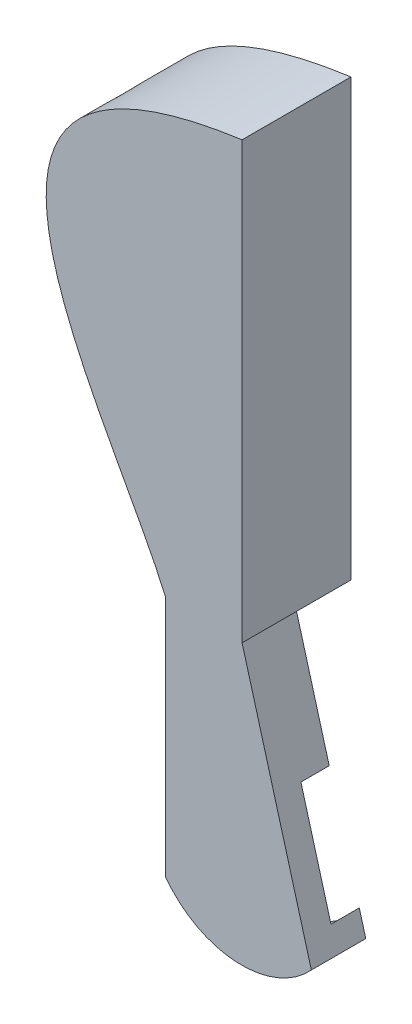
ISO-10303-21;
HEADER;
FILE_DESCRIPTION(('STEP AP214'),'2;1');
FILE_NAME('part.step','',(''),(''),'','','');
FILE_SCHEMA(('AUTOMOTIVE_DESIGN { 1 0 10303 214 1 1 1 1 }'));
ENDSEC;
DATA;
#1=APPLICATION_CONTEXT('core data for automotive mechanical design processes');
#2=APPLICATION_PROTOCOL_DEFINITION('international standard','automotive_design',2000,#1);
#3=PRODUCT_CONTEXT('',#1,'mechanical');
#4=PRODUCT('Part','Part','',(#3));
#5=PRODUCT_RELATED_PRODUCT_CATEGORY('part','',(#4));
#6=PRODUCT_DEFINITION_FORMATION('','',#4);
#7=PRODUCT_DEFINITION_CONTEXT('part definition',#1,'design');
#8=PRODUCT_DEFINITION('design','',#6,#7);
#9=PRODUCT_DEFINITION_SHAPE('','',#8);
#10=(LENGTH_UNIT() NAMED_UNIT(*) SI_UNIT(.MILLI.,.METRE.));
#11=(NAMED_UNIT(*) PLANE_ANGLE_UNIT() SI_UNIT($,.RADIAN.));
#12=(NAMED_UNIT(*) SI_UNIT($,.STERADIAN.) SOLID_ANGLE_UNIT());
#13=UNCERTAINTY_MEASURE_WITH_UNIT(LENGTH_MEASURE(1.E-05),#10,'distance_accuracy_value','');
#14=(GEOMETRIC_REPRESENTATION_CONTEXT(3) GLOBAL_UNCERTAINTY_ASSIGNED_CONTEXT((#13)) GLOBAL_UNIT_ASSIGNED_CONTEXT((#10,
#11,#12)) REPRESENTATION_CONTEXT('',''));
#15=CARTESIAN_POINT('',(0.,0.,0.));
#16=DIRECTION('',(0.,0.,1.));
#17=DIRECTION('',(1.,0.,0.));
#18=AXIS2_PLACEMENT_3D('',#15,#16,#17);
#19=CARTESIAN_POINT('',(0.220726200140617,284.828286352385,50.));
#20=CARTESIAN_POINT('',(-159.978737061135,262.606607754272,50.));
#21=CARTESIAN_POINT('',(-63.0007246030179,150.139017080568,50.));
#22=CARTESIAN_POINT('',(-35.,85.6249999999999,50.));
#23=B_SPLINE_CURVE_WITH_KNOTS('',3,(#19,#20,#21,#22),.UNSPECIFIED.,.F.,.F.,(4,4),(0.,1.),.UNSPECIFIED.);
#24=DIRECTION('',(0.,0.,-1.));
#25=VECTOR('',#24,1.);
#26=SURFACE_OF_LINEAR_EXTRUSION('',#23,#25);
#27=CARTESIAN_POINT('',(0.220726200140617,284.828286352385,0.));
#28=CARTESIAN_POINT('',(-159.978737061135,262.606607754272,0.));
#29=CARTESIAN_POINT('',(-63.0007246030179,150.139017080568,0.));
#30=CARTESIAN_POINT('',(-35.,85.6249999999999,0.));
#31=B_SPLINE_CURVE_WITH_KNOTS('',3,(#27,#28,#29,#30),.UNSPECIFIED.,.F.,.F.,(4,4),(0.,1.),.UNSPECIFIED.);
#32=CARTESIAN_POINT('',(0.220726200140617,284.828286352385,0.));
#33=VERTEX_POINT('',#32);
#34=CARTESIAN_POINT('',(-35.,85.6249999999999,0.));
#35=VERTEX_POINT('',#34);
#36=EDGE_CURVE('E133',#33,#35,#31,.T.);
#37=ORIENTED_EDGE('',*,*,#36,.T.);
#38=DIRECTION('',(0.,0.,-1.));
#39=VECTOR('',#38,1.);
#40=CARTESIAN_POINT('',(-35.,85.6249999999999,50.));
#41=LINE('',#40,#39);
#42=CARTESIAN_POINT('',(-35.,85.6249999999999,50.));
#43=VERTEX_POINT('',#42);
#44=EDGE_CURVE('E150',#43,#35,#41,.T.);
#45=ORIENTED_EDGE('',*,*,#44,.F.);
#46=CARTESIAN_POINT('',(0.220726200140617,284.828286352385,50.));
#47=VERTEX_POINT('',#46);
#48=EDGE_CURVE('E119',#47,#43,#23,.T.);
#49=ORIENTED_EDGE('',*,*,#48,.F.);
#50=DIRECTION('',(0.,0.,-1.));
#51=VECTOR('',#50,1.);
#52=CARTESIAN_POINT('',(0.220726200140617,284.828286352385,50.));
#53=LINE('',#52,#51);
#54=EDGE_CURVE('E132',#47,#33,#53,.T.);
#55=ORIENTED_EDGE('',*,*,#54,.T.);
#56=EDGE_LOOP('',(#37,#45,#49,#55));
#57=FACE_BOUND('',#56,.T.);
#58=ADVANCED_FACE('F33',(#57),#26,.F.);
#59=CARTESIAN_POINT('',(-35.,-85.6249999999999,50.));
#60=DIRECTION('',(1.,0.,0.));
#61=DIRECTION('',(0.,0.,-1.));
#62=AXIS2_PLACEMENT_3D('',#59,#60,#61);
#63=PLANE('',#62);
#64=DIRECTION('',(0.,-1.,0.));
#65=VECTOR('',#64,1.);
#66=CARTESIAN_POINT('',(-35.,-85.6249999999999,25.));
#67=LINE('',#66,#65);
#68=CARTESIAN_POINT('',(-35.,75.0232065963302,25.));
#69=VERTEX_POINT('',#68);
#70=CARTESIAN_POINT('',(-35.,-25.7429728987199,25.));
#71=VERTEX_POINT('',#70);
#72=EDGE_CURVE('E115',#69,#71,#67,.T.);
#73=ORIENTED_EDGE('',*,*,#72,.T.);
#74=DIRECTION('',(0.,0.,-1.));
#75=VECTOR('',#74,1.);
#76=CARTESIAN_POINT('',(-35.,-25.7429728987199,50.));
#77=LINE('',#76,#75);
#78=CARTESIAN_POINT('',(-35.,-25.7429728987199,50.));
#79=VERTEX_POINT('',#78);
#80=EDGE_CURVE('E48',#79,#71,#77,.T.);
#81=ORIENTED_EDGE('',*,*,#80,.F.);
#82=DIRECTION('',(0.,-1.,0.));
#83=VECTOR('',#82,1.);
#84=CARTESIAN_POINT('',(-35.,-85.6249999999999,50.));
#85=LINE('',#84,#83);
#86=EDGE_CURVE('E112',#43,#79,#85,.T.);
#87=ORIENTED_EDGE('',*,*,#86,.F.);
#88=ORIENTED_EDGE('',*,*,#44,.T.);
#89=DIRECTION('',(0.,-1.,0.));
#90=VECTOR('',#89,1.);
#91=CARTESIAN_POINT('',(-35.,-85.6249999999999,0.));
#92=LINE('',#91,#90);
#93=CARTESIAN_POINT('',(-35.,75.0232065963301,0.));
#94=VERTEX_POINT('',#93);
#95=EDGE_CURVE('E138',#35,#94,#92,.T.);
#96=ORIENTED_EDGE('',*,*,#95,.T.);
#97=DIRECTION('',(0.,0.,1.));
#98=VECTOR('',#97,1.);
#99=CARTESIAN_POINT('',(-35.,75.0232065963302,50.));
#100=LINE('',#99,#98);
#101=EDGE_CURVE('E174',#94,#69,#100,.T.);
#102=ORIENTED_EDGE('',*,*,#101,.T.);
#103=EDGE_LOOP('',(#73,#81,#87,#88,#96,#102));
#104=FACE_BOUND('',#103,.T.);
#105=ADVANCED_FACE('F110',(#104),#63,.F.);
#106=CARTESIAN_POINT('',(0.221790000790527,84.8282863552137,50.));
#107=DIRECTION('',(-0.963367879663412,-0.268183385825488,0.));
#108=DIRECTION('',(0.268183385825488,-0.963367879663412,0.));
#109=AXIS2_PLACEMENT_3D('',#106,#107,#108);
#110=PLANE('',#109);
#111=DIRECTION('',(-0.268183385825488,0.963367879663412,0.));
#112=VECTOR('',#111,1.);
#113=CARTESIAN_POINT('',(0.221790000790527,84.8282863552137,50.));
#114=LINE('',#113,#112);
#115=CARTESIAN_POINT('',(32.0135514067666,-29.3740221963309,50.));
#116=VERTEX_POINT('',#115);
#117=CARTESIAN_POINT('',(0.221790000790527,84.8282863552137,50.));
#118=VERTEX_POINT('',#117);
#119=EDGE_CURVE('E121',#116,#118,#114,.T.);
#120=ORIENTED_EDGE('',*,*,#119,.F.);
#121=DIRECTION('',(0.,0.,-1.));
#122=VECTOR('',#121,1.);
#123=CARTESIAN_POINT('',(32.0135514067666,-29.3740221963309,50.));
#124=LINE('',#123,#122);
#125=CARTESIAN_POINT('',(32.0135514067666,-29.3740221963309,25.));
#126=VERTEX_POINT('',#125);
#127=EDGE_CURVE('E102',#116,#126,#124,.T.);
#128=ORIENTED_EDGE('',*,*,#127,.T.);
#129=DIRECTION('',(0.268183385825487,-0.963367879663412,0.));
#130=VECTOR('',#129,1.);
#131=CARTESIAN_POINT('',(0.221790000790537,84.8282863552137,25.));
#132=LINE('',#131,#130);
#133=CARTESIAN_POINT('',(29.0271028135332,-18.6461068926618,25.));
#134=VERTEX_POINT('',#133);
#135=EDGE_CURVE('E158',#134,#126,#132,.T.);
#136=ORIENTED_EDGE('',*,*,#135,.F.);
#137=DIRECTION('',(0.,0.,-1.));
#138=VECTOR('',#137,1.);
#139=CARTESIAN_POINT('',(29.0271028135332,-18.6461068926618,38.));
#140=LINE('',#139,#138);
#141=CARTESIAN_POINT('',(29.0271028135332,-18.6461068926618,38.));
#142=VERTEX_POINT('',#141);
#143=EDGE_CURVE('E56',#134,#142,#140,.F.);
#144=ORIENTED_EDGE('',*,*,#143,.T.);
#145=DIRECTION('',(0.268183385825488,-0.963367879663412,0.));
#146=VECTOR('',#145,1.);
#147=CARTESIAN_POINT('',(0.221790000790527,84.8282863552137,38.));
#148=LINE('',#147,#146);
#149=CARTESIAN_POINT('',(15.2169204209926,30.9628056367827,38.));
#150=VERTEX_POINT('',#149);
#151=EDGE_CURVE('E11',#150,#142,#148,.T.);
#152=ORIENTED_EDGE('',*,*,#151,.F.);
#153=DIRECTION('',(0.,0.,-1.));
#154=VECTOR('',#153,1.);
#155=CARTESIAN_POINT('',(15.2169204209926,30.9628056367826,38.));
#156=LINE('',#155,#154);
#157=CARTESIAN_POINT('',(15.2169204209926,30.9628056367826,25.));
#158=VERTEX_POINT('',#157);
#159=EDGE_CURVE('E169',#150,#158,#156,.T.);
#160=ORIENTED_EDGE('',*,*,#159,.T.);
#161=CARTESIAN_POINT('',(0.221790000790537,84.8282863552137,25.));
#162=VERTEX_POINT('',#161);
#163=EDGE_CURVE('E160',#162,#158,#132,.T.);
#164=ORIENTED_EDGE('',*,*,#163,.F.);
#165=DIRECTION('',(0.,0.,-1.));
#166=VECTOR('',#165,1.);
#167=CARTESIAN_POINT('',(0.221790000790527,84.8282863552137,50.));
#168=LINE('',#167,#166);
#169=EDGE_CURVE('E147',#118,#162,#168,.T.);
#170=ORIENTED_EDGE('',*,*,#169,.F.);
#171=EDGE_LOOP('',(#120,#128,#136,#144,#152,#160,#164,#170));
#172=FACE_BOUND('',#171,.T.);
#173=ADVANCED_FACE('F163',(#172),#110,.F.);
#174=CARTESIAN_POINT('',(0.221790000790527,84.8282863552137,50.));
#175=DIRECTION('',(-0.999999999985854,-5.31900324955009E-06,0.));
#176=DIRECTION('',(5.31900324955009E-06,-0.999999999985854,0.));
#177=AXIS2_PLACEMENT_3D('',#174,#175,#176);
#178=PLANE('',#177);
#179=DIRECTION('',(-5.31900324955009E-06,0.999999999985854,0.));
#180=VECTOR('',#179,1.);
#181=CARTESIAN_POINT('',(0.221790000790527,84.8282863552137,0.));
#182=LINE('',#181,#180);
#183=CARTESIAN_POINT('',(0.221790000790537,84.8282863552137,0.));
#184=VERTEX_POINT('',#183);
#185=EDGE_CURVE('E125',#184,#33,#182,.T.);
#186=ORIENTED_EDGE('',*,*,#185,.T.);
#187=ORIENTED_EDGE('',*,*,#54,.F.);
#188=DIRECTION('',(-5.31900324955009E-06,0.999999999985854,0.));
#189=VECTOR('',#188,1.);
#190=CARTESIAN_POINT('',(0.221790000790527,84.8282863552137,50.));
#191=LINE('',#190,#189);
#192=EDGE_CURVE('E123',#118,#47,#191,.T.);
#193=ORIENTED_EDGE('',*,*,#192,.F.);
#194=ORIENTED_EDGE('',*,*,#169,.T.);
#195=DIRECTION('',(0.,0.,1.));
#196=VECTOR('',#195,1.);
#197=CARTESIAN_POINT('',(0.221790000790537,84.8282863552137,-41.3763691391845));
#198=LINE('',#197,#196);
#199=EDGE_CURVE('E165',#184,#162,#198,.T.);
#200=ORIENTED_EDGE('',*,*,#199,.F.);
#201=EDGE_LOOP('',(#186,#187,#193,#194,#200));
#202=FACE_BOUND('',#201,.T.);
#203=ADVANCED_FACE('F186',(#202),#178,.F.);
#204=CARTESIAN_POINT('',(-87.9647073490397,201.086270107113,50.));
#205=DIRECTION('',(0.,0.,-1.));
#206=DIRECTION('',(-1.,0.,0.));
#207=AXIS2_PLACEMENT_3D('',#204,#205,#206);
#208=PLANE('',#207);
#209=ORIENTED_EDGE('',*,*,#86,.T.);
#210=CARTESIAN_POINT('',(0.,0.,50.));
#211=DIRECTION('',(0.,0.,1.));
#212=DIRECTION('',(-1.,0.,0.));
#213=AXIS2_PLACEMENT_3D('',#210,#211,#212);
#214=CIRCLE('',#213,43.4476771952682);
#215=EDGE_CURVE('E99',#79,#116,#214,.T.);
#216=ORIENTED_EDGE('',*,*,#215,.T.);
#217=ORIENTED_EDGE('',*,*,#119,.T.);
#218=ORIENTED_EDGE('',*,*,#192,.T.);
#219=ORIENTED_EDGE('',*,*,#48,.T.);
#220=EDGE_LOOP('',(#209,#216,#217,#218,#219));
#221=FACE_BOUND('',#220,.T.);
#222=ADVANCED_FACE('F117',(#221),#208,.F.);
#223=CARTESIAN_POINT('',(-87.9647073490397,201.086270107113,0.));
#224=DIRECTION('',(0.,0.,-1.));
#225=DIRECTION('',(-1.,0.,0.));
#226=AXIS2_PLACEMENT_3D('',#223,#224,#225);
#227=PLANE('',#226);
#228=DIRECTION('',(0.963367879663412,0.268183385825488,0.));
#229=VECTOR('',#228,1.);
#230=CARTESIAN_POINT('',(-51.5858024995493,70.4060330691039,0.));
#231=LINE('',#230,#229);
#232=EDGE_CURVE('E152',#94,#184,#231,.T.);
#233=ORIENTED_EDGE('',*,*,#232,.F.);
#234=ORIENTED_EDGE('',*,*,#95,.F.);
#235=ORIENTED_EDGE('',*,*,#36,.F.);
#236=ORIENTED_EDGE('',*,*,#185,.F.);
#237=EDGE_LOOP('',(#233,#234,#235,#236));
#238=FACE_BOUND('',#237,.T.);
#239=ADVANCED_FACE('F182',(#238),#227,.T.);
#240=CARTESIAN_POINT('',(-132.824758814397,47.7906450897407,25.));
#241=DIRECTION('',(0.,0.,1.));
#242=DIRECTION('',(1.,0.,0.));
#243=AXIS2_PLACEMENT_3D('',#240,#241,#242);
#244=PLANE('',#243);
#245=ORIENTED_EDGE('',*,*,#135,.T.);
#246=CARTESIAN_POINT('',(0.,0.,25.));
#247=DIRECTION('',(0.,0.,1.));
#248=DIRECTION('',(-1.,0.,0.));
#249=AXIS2_PLACEMENT_3D('',#246,#247,#248);
#250=CIRCLE('',#249,43.4476771952682);
#251=EDGE_CURVE('E106',#71,#126,#250,.T.);
#252=ORIENTED_EDGE('',*,*,#251,.F.);
#253=ORIENTED_EDGE('',*,*,#72,.F.);
#254=DIRECTION('',(0.963367879663412,0.268183385825488,0.));
#255=VECTOR('',#254,1.);
#256=CARTESIAN_POINT('',(-132.824758814397,47.7906450897407,25.));
#257=LINE('',#256,#255);
#258=EDGE_CURVE('E167',#69,#162,#257,.T.);
#259=ORIENTED_EDGE('',*,*,#258,.T.);
#260=ORIENTED_EDGE('',*,*,#163,.T.);
#261=CARTESIAN_POINT('',(0.,0.,25.));
#262=DIRECTION('',(0.,0.,1.));
#263=DIRECTION('',(1.,0.,0.));
#264=AXIS2_PLACEMENT_3D('',#261,#262,#263);
#265=CIRCLE('',#264,34.5);
#266=EDGE_CURVE('E41',#158,#134,#265,.T.);
#267=ORIENTED_EDGE('',*,*,#266,.T.);
#268=EDGE_LOOP('',(#245,#252,#253,#259,#260,#267));
#269=FACE_BOUND('',#268,.T.);
#270=ADVANCED_FACE('F157',(#269),#244,.F.);
#271=CARTESIAN_POINT('',(-132.824758814397,47.7906450897407,-41.3763691391845));
#272=DIRECTION('',(-0.268183385825488,0.963367879663412,0.));
#273=DIRECTION('',(-0.963367879663412,-0.268183385825488,0.));
#274=AXIS2_PLACEMENT_3D('',#271,#272,#273);
#275=PLANE('',#274);
#276=ORIENTED_EDGE('',*,*,#232,.T.);
#277=ORIENTED_EDGE('',*,*,#199,.T.);
#278=ORIENTED_EDGE('',*,*,#258,.F.);
#279=ORIENTED_EDGE('',*,*,#101,.F.);
#280=EDGE_LOOP('',(#276,#277,#278,#279));
#281=FACE_BOUND('',#280,.T.);
#282=ADVANCED_FACE('F178',(#281),#275,.F.);
#283=CARTESIAN_POINT('',(0.,0.,38.));
#284=DIRECTION('',(0.,0.,-1.));
#285=DIRECTION('',(-1.,0.,0.));
#286=AXIS2_PLACEMENT_3D('',#283,#284,#285);
#287=PLANE('',#286);
#288=ORIENTED_EDGE('',*,*,#151,.T.);
#289=CARTESIAN_POINT('',(0.,0.,38.));
#290=DIRECTION('',(0.,0.,-1.));
#291=DIRECTION('',(-1.,0.,0.));
#292=AXIS2_PLACEMENT_3D('',#289,#290,#291);
#293=CIRCLE('',#292,34.5);
#294=EDGE_CURVE('E279',#142,#150,#293,.T.);
#295=ORIENTED_EDGE('',*,*,#294,.T.);
#296=EDGE_LOOP('',(#288,#295));
#297=FACE_BOUND('',#296,.T.);
#298=ADVANCED_FACE('F206',(#297),#287,.T.);
#299=CARTESIAN_POINT('',(0.,0.,38.));
#300=DIRECTION('',(0.,0.,-1.));
#301=DIRECTION('',(-1.,0.,0.));
#302=AXIS2_PLACEMENT_3D('',#299,#300,#301);
#303=CYLINDRICAL_SURFACE('',#302,34.5);
#304=ORIENTED_EDGE('',*,*,#294,.F.);
#305=ORIENTED_EDGE('',*,*,#143,.F.);
#306=ORIENTED_EDGE('',*,*,#266,.F.);
#307=ORIENTED_EDGE('',*,*,#159,.F.);
#308=EDGE_LOOP('',(#304,#305,#306,#307));
#309=FACE_BOUND('',#308,.T.);
#310=ADVANCED_FACE('F209',(#309),#303,.F.);
#311=CARTESIAN_POINT('',(0.,0.,50.));
#312=DIRECTION('',(0.,0.,-1.));
#313=DIRECTION('',(-1.,0.,0.));
#314=AXIS2_PLACEMENT_3D('',#311,#312,#313);
#315=CYLINDRICAL_SURFACE('',#314,43.4476771952682);
#316=ORIENTED_EDGE('',*,*,#251,.T.);
#317=ORIENTED_EDGE('',*,*,#127,.F.);
#318=ORIENTED_EDGE('',*,*,#215,.F.);
#319=ORIENTED_EDGE('',*,*,#80,.T.);
#320=EDGE_LOOP('',(#316,#317,#318,#319));
#321=FACE_BOUND('',#320,.T.);
#322=ADVANCED_FACE('F100',(#321),#315,.T.);
#323=CLOSED_SHELL('',(#58,#105,#173,#203,#222,#239,#270,#282,#298,#310,#322));
#324=MANIFOLD_SOLID_BREP('B2',#323);
#325=ADVANCED_BREP_SHAPE_REPRESENTATION('',(#18,#324),#14);
#326=SHAPE_DEFINITION_REPRESENTATION(#9,#325);
ENDSEC;
END-ISO-10303-21;
